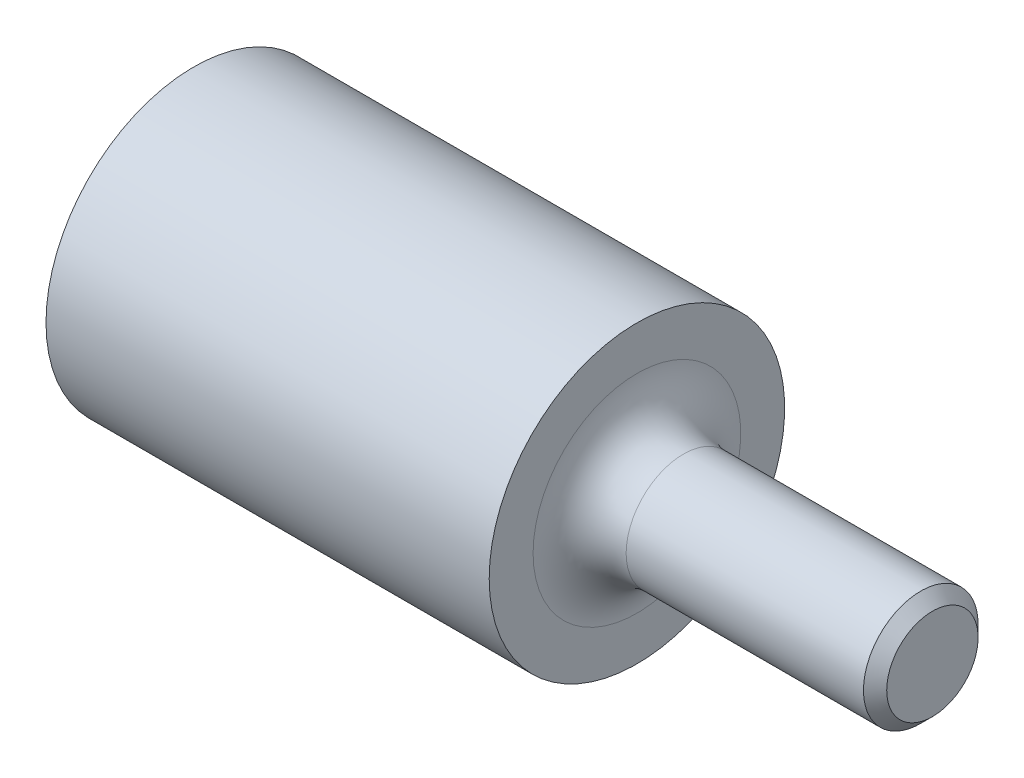
ISO-10303-21;
HEADER;
FILE_DESCRIPTION(('STEP AP214'),'2;1');
FILE_NAME('part.step','',(''),(''),'','','');
FILE_SCHEMA(('AUTOMOTIVE_DESIGN { 1 0 10303 214 1 1 1 1 }'));
ENDSEC;
DATA;
#1=APPLICATION_CONTEXT('core data for automotive mechanical design processes');
#2=APPLICATION_PROTOCOL_DEFINITION('international standard','automotive_design',2000,#1);
#3=PRODUCT_CONTEXT('',#1,'mechanical');
#4=PRODUCT('Part','Part','',(#3));
#5=PRODUCT_RELATED_PRODUCT_CATEGORY('part','',(#4));
#6=PRODUCT_DEFINITION_FORMATION('','',#4);
#7=PRODUCT_DEFINITION_CONTEXT('part definition',#1,'design');
#8=PRODUCT_DEFINITION('design','',#6,#7);
#9=PRODUCT_DEFINITION_SHAPE('','',#8);
#10=(LENGTH_UNIT() NAMED_UNIT(*) SI_UNIT(.MILLI.,.METRE.));
#11=(NAMED_UNIT(*) PLANE_ANGLE_UNIT() SI_UNIT($,.RADIAN.));
#12=(NAMED_UNIT(*) SI_UNIT($,.STERADIAN.) SOLID_ANGLE_UNIT());
#13=UNCERTAINTY_MEASURE_WITH_UNIT(LENGTH_MEASURE(1.E-05),#10,'distance_accuracy_value','');
#14=(GEOMETRIC_REPRESENTATION_CONTEXT(3) GLOBAL_UNCERTAINTY_ASSIGNED_CONTEXT((#13)) GLOBAL_UNIT_ASSIGNED_CONTEXT((#10,
#11,#12)) REPRESENTATION_CONTEXT('',''));
#15=CARTESIAN_POINT('',(0.,0.,0.));
#16=DIRECTION('',(0.,0.,1.));
#17=DIRECTION('',(1.,0.,0.));
#18=AXIS2_PLACEMENT_3D('',#15,#16,#17);
#19=CARTESIAN_POINT('',(0.,0.,-6.35));
#20=DIRECTION('',(1.,0.,0.));
#21=DIRECTION('',(0.,0.,-1.));
#22=AXIS2_PLACEMENT_3D('',#19,#20,#21);
#23=PLANE('',#22);
#24=DIRECTION('',(0.,1.,0.));
#25=VECTOR('',#24,1.);
#26=CARTESIAN_POINT('',(0.,-1.50804144505382,2.794));
#27=LINE('',#26,#25);
#28=CARTESIAN_POINT('',(0.,-1.50804144505382,2.794));
#29=VERTEX_POINT('',#28);
#30=CARTESIAN_POINT('',(0.,1.50804144505382,2.794));
#31=VERTEX_POINT('',#30);
#32=EDGE_CURVE('E72',#29,#31,#27,.T.);
#33=ORIENTED_EDGE('',*,*,#32,.F.);
#34=CARTESIAN_POINT('',(0.,0.,0.));
#35=DIRECTION('',(-1.,0.,0.));
#36=DIRECTION('',(0.,0.,1.));
#37=AXIS2_PLACEMENT_3D('',#34,#35,#36);
#38=CIRCLE('',#37,3.175);
#39=EDGE_CURVE('E52',#31,#29,#38,.T.);
#40=ORIENTED_EDGE('',*,*,#39,.F.);
#41=EDGE_LOOP('',(#33,#40));
#42=FACE_BOUND('',#41,.T.);
#43=CARTESIAN_POINT('',(0.,0.,0.));
#44=DIRECTION('',(-1.,0.,0.));
#45=DIRECTION('',(0.,0.,1.));
#46=AXIS2_PLACEMENT_3D('',#43,#44,#45);
#47=CIRCLE('',#46,6.35);
#48=CARTESIAN_POINT('',(0.,0.,6.35));
#49=VERTEX_POINT('',#48);
#50=EDGE_CURVE('E68',#49,#49,#47,.T.);
#51=ORIENTED_EDGE('',*,*,#50,.T.);
#52=EDGE_LOOP('',(#51));
#53=FACE_BOUND('',#52,.T.);
#54=ADVANCED_FACE('F37',(#42,#53),#23,.F.);
#55=CARTESIAN_POINT('',(31.75,0.,-2.4638));
#56=DIRECTION('',(-1.,0.,0.));
#57=DIRECTION('',(0.,0.,1.));
#58=AXIS2_PLACEMENT_3D('',#55,#56,#57);
#59=PLANE('',#58);
#60=CARTESIAN_POINT('',(31.75,0.,0.));
#61=DIRECTION('',(-1.,0.,0.));
#62=DIRECTION('',(0.,0.,1.));
#63=AXIS2_PLACEMENT_3D('',#60,#61,#62);
#64=CIRCLE('',#63,1.9638);
#65=CARTESIAN_POINT('',(31.75,0.,1.9638));
#66=VERTEX_POINT('',#65);
#67=EDGE_CURVE('E11',#66,#66,#64,.F.);
#68=ORIENTED_EDGE('',*,*,#67,.T.);
#69=EDGE_LOOP('',(#68));
#70=FACE_BOUND('',#69,.T.);
#71=ADVANCED_FACE('F109',(#70),#59,.F.);
#72=CARTESIAN_POINT('',(0.,0.,0.));
#73=DIRECTION('',(-1.,0.,0.));
#74=DIRECTION('',(0.,0.,1.));
#75=AXIS2_PLACEMENT_3D('',#72,#73,#74);
#76=CYLINDRICAL_SURFACE('',#75,2.4638);
#77=CARTESIAN_POINT('',(31.25,0.,0.));
#78=DIRECTION('',(-1.,0.,0.));
#79=DIRECTION('',(0.,0.,1.));
#80=AXIS2_PLACEMENT_3D('',#77,#78,#79);
#81=CIRCLE('',#80,2.4638);
#82=CARTESIAN_POINT('',(31.25,0.,2.4638));
#83=VERTEX_POINT('',#82);
#84=EDGE_CURVE('E45',#83,#83,#81,.T.);
#85=ORIENTED_EDGE('',*,*,#84,.T.);
#86=EDGE_LOOP('',(#85));
#87=FACE_BOUND('',#86,.T.);
#88=CARTESIAN_POINT('',(21.05,0.,0.));
#89=DIRECTION('',(-1.,0.,0.));
#90=DIRECTION('',(0.,0.,1.));
#91=AXIS2_PLACEMENT_3D('',#88,#89,#90);
#92=CIRCLE('',#91,2.4638);
#93=CARTESIAN_POINT('',(21.05,0.,2.4638));
#94=VERTEX_POINT('',#93);
#95=EDGE_CURVE('E91',#94,#94,#92,.F.);
#96=ORIENTED_EDGE('',*,*,#95,.T.);
#97=EDGE_LOOP('',(#96));
#98=FACE_BOUND('',#97,.T.);
#99=ADVANCED_FACE('F96',(#87,#98),#76,.T.);
#100=CARTESIAN_POINT('',(19.05,0.,-6.35));
#101=DIRECTION('',(-1.,0.,0.));
#102=DIRECTION('',(0.,0.,1.));
#103=AXIS2_PLACEMENT_3D('',#100,#101,#102);
#104=PLANE('',#103);
#105=CARTESIAN_POINT('',(19.05,0.,0.));
#106=DIRECTION('',(-1.,0.,0.));
#107=DIRECTION('',(0.,0.,1.));
#108=AXIS2_PLACEMENT_3D('',#105,#106,#107);
#109=CIRCLE('',#108,4.4638);
#110=CARTESIAN_POINT('',(19.05,0.,4.4638));
#111=VERTEX_POINT('',#110);
#112=EDGE_CURVE('E88',#111,#111,#109,.T.);
#113=ORIENTED_EDGE('',*,*,#112,.T.);
#114=EDGE_LOOP('',(#113));
#115=FACE_BOUND('',#114,.T.);
#116=CARTESIAN_POINT('',(19.05,0.,0.));
#117=DIRECTION('',(-1.,0.,0.));
#118=DIRECTION('',(0.,0.,1.));
#119=AXIS2_PLACEMENT_3D('',#116,#117,#118);
#120=CIRCLE('',#119,6.35);
#121=CARTESIAN_POINT('',(19.05,0.,6.35));
#122=VERTEX_POINT('',#121);
#123=EDGE_CURVE('E85',#122,#122,#120,.T.);
#124=ORIENTED_EDGE('',*,*,#123,.F.);
#125=EDGE_LOOP('',(#124));
#126=FACE_BOUND('',#125,.T.);
#127=ADVANCED_FACE('F126',(#115,#126),#104,.F.);
#128=CARTESIAN_POINT('',(0.,0.,0.));
#129=DIRECTION('',(-1.,0.,0.));
#130=DIRECTION('',(0.,0.,1.));
#131=AXIS2_PLACEMENT_3D('',#128,#129,#130);
#132=CYLINDRICAL_SURFACE('',#131,6.35);
#133=ORIENTED_EDGE('',*,*,#50,.F.);
#134=EDGE_LOOP('',(#133));
#135=FACE_BOUND('',#134,.T.);
#136=ORIENTED_EDGE('',*,*,#123,.T.);
#137=EDGE_LOOP('',(#136));
#138=FACE_BOUND('',#137,.T.);
#139=ADVANCED_FACE('F119',(#135,#138),#132,.T.);
#140=CARTESIAN_POINT('',(21.05,0.,0.));
#141=DIRECTION('',(-1.,0.,0.));
#142=DIRECTION('',(0.,0.,1.));
#143=AXIS2_PLACEMENT_3D('',#140,#141,#142);
#144=TOROIDAL_SURFACE('',#143,4.4638,2.);
#145=ORIENTED_EDGE('',*,*,#95,.F.);
#146=EDGE_LOOP('',(#145));
#147=FACE_BOUND('',#146,.T.);
#148=ORIENTED_EDGE('',*,*,#112,.F.);
#149=EDGE_LOOP('',(#148));
#150=FACE_BOUND('',#149,.T.);
#151=ADVANCED_FACE('F117',(#147,#150),#144,.F.);
#152=CARTESIAN_POINT('',(15.875,0.,0.));
#153=DIRECTION('',(-1.,0.,0.));
#154=DIRECTION('',(0.,0.,1.));
#155=AXIS2_PLACEMENT_3D('',#152,#153,#154);
#156=CYLINDRICAL_SURFACE('',#155,3.175);
#157=ORIENTED_EDGE('',*,*,#39,.T.);
#158=DIRECTION('',(-1.,0.,0.));
#159=VECTOR('',#158,1.);
#160=CARTESIAN_POINT('',(15.875,-1.50804144505382,2.794));
#161=LINE('',#160,#159);
#162=CARTESIAN_POINT('',(15.875,-1.50804144505382,2.794));
#163=VERTEX_POINT('',#162);
#164=EDGE_CURVE('E69',#163,#29,#161,.T.);
#165=ORIENTED_EDGE('',*,*,#164,.F.);
#166=CARTESIAN_POINT('',(15.875,0.,0.));
#167=DIRECTION('',(-1.,0.,0.));
#168=DIRECTION('',(0.,0.,1.));
#169=AXIS2_PLACEMENT_3D('',#166,#167,#168);
#170=CIRCLE('',#169,3.175);
#171=CARTESIAN_POINT('',(15.875,1.50804144505382,2.794));
#172=VERTEX_POINT('',#171);
#173=EDGE_CURVE('E66',#172,#163,#170,.T.);
#174=ORIENTED_EDGE('',*,*,#173,.F.);
#175=DIRECTION('',(-1.,0.,0.));
#176=VECTOR('',#175,1.);
#177=CARTESIAN_POINT('',(15.875,1.50804144505382,2.794));
#178=LINE('',#177,#176);
#179=EDGE_CURVE('E60',#172,#31,#178,.T.);
#180=ORIENTED_EDGE('',*,*,#179,.T.);
#181=EDGE_LOOP('',(#157,#165,#174,#180));
#182=FACE_BOUND('',#181,.T.);
#183=ADVANCED_FACE('F64',(#182),#156,.F.);
#184=CARTESIAN_POINT('',(15.875,-1.50804144505382,2.794));
#185=DIRECTION('',(0.,0.,1.));
#186=DIRECTION('',(1.,0.,0.));
#187=AXIS2_PLACEMENT_3D('',#184,#185,#186);
#188=PLANE('',#187);
#189=ORIENTED_EDGE('',*,*,#32,.T.);
#190=ORIENTED_EDGE('',*,*,#179,.F.);
#191=DIRECTION('',(0.,1.,0.));
#192=VECTOR('',#191,1.);
#193=CARTESIAN_POINT('',(15.875,-1.50804144505382,2.794));
#194=LINE('',#193,#192);
#195=EDGE_CURVE('E79',#163,#172,#194,.T.);
#196=ORIENTED_EDGE('',*,*,#195,.F.);
#197=ORIENTED_EDGE('',*,*,#164,.T.);
#198=EDGE_LOOP('',(#189,#190,#196,#197));
#199=FACE_BOUND('',#198,.T.);
#200=ADVANCED_FACE('F73',(#199),#188,.F.);
#201=CARTESIAN_POINT('',(15.875,0.,0.));
#202=DIRECTION('',(-1.,0.,0.));
#203=DIRECTION('',(0.,0.,1.));
#204=AXIS2_PLACEMENT_3D('',#201,#202,#203);
#205=PLANE('',#204);
#206=ORIENTED_EDGE('',*,*,#173,.T.);
#207=ORIENTED_EDGE('',*,*,#195,.T.);
#208=EDGE_LOOP('',(#206,#207));
#209=FACE_BOUND('',#208,.T.);
#210=ADVANCED_FACE('F100',(#209),#205,.T.);
#211=CARTESIAN_POINT('',(31.25,0.,0.));
#212=DIRECTION('',(-1.,0.,0.));
#213=DIRECTION('',(0.,0.,1.));
#214=AXIS2_PLACEMENT_3D('',#211,#212,#213);
#215=CONICAL_SURFACE('',#214,2.4638,0.785398163397442);
#216=ORIENTED_EDGE('',*,*,#67,.F.);
#217=EDGE_LOOP('',(#216));
#218=FACE_BOUND('',#217,.T.);
#219=ORIENTED_EDGE('',*,*,#84,.F.);
#220=EDGE_LOOP('',(#219));
#221=FACE_BOUND('',#220,.T.);
#222=ADVANCED_FACE('F39',(#218,#221),#215,.T.);
#223=CLOSED_SHELL('',(#54,#71,#99,#127,#139,#151,#183,#200,#210,#222));
#224=MANIFOLD_SOLID_BREP('B2',#223);
#225=ADVANCED_BREP_SHAPE_REPRESENTATION('',(#18,#224),#14);
#226=SHAPE_DEFINITION_REPRESENTATION(#9,#225);
ENDSEC;
END-ISO-10303-21;
